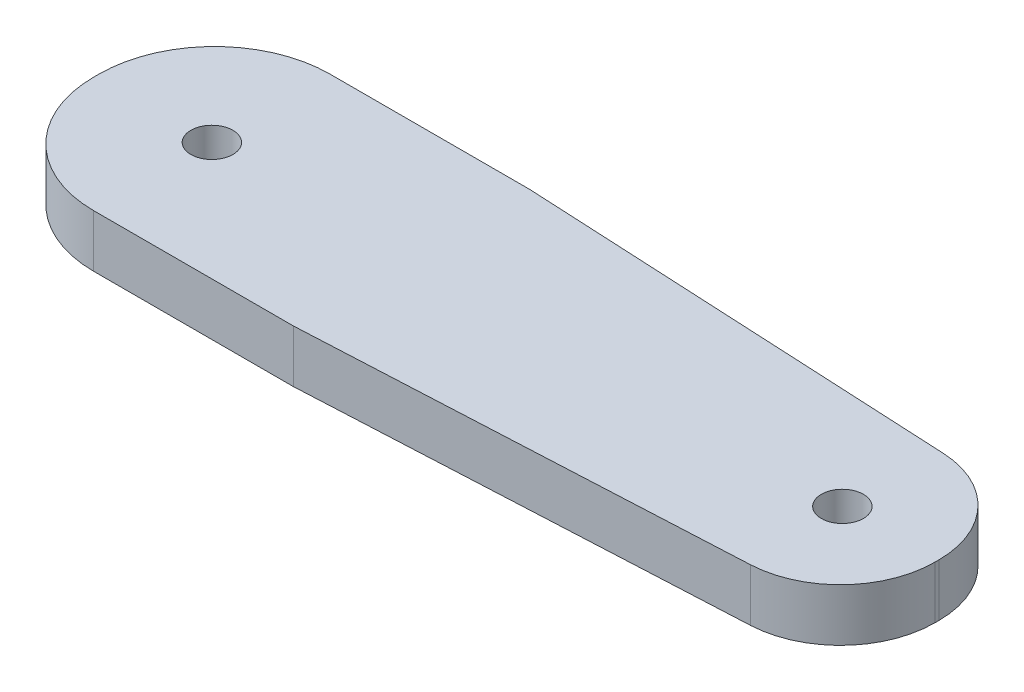
ISO-10303-21;
HEADER;
FILE_DESCRIPTION(('STEP AP214'),'2;1');
FILE_NAME('part.step','',(''),(''),'','','');
FILE_SCHEMA(('AUTOMOTIVE_DESIGN { 1 0 10303 214 1 1 1 1 }'));
ENDSEC;
DATA;
#1=APPLICATION_CONTEXT('core data for automotive mechanical design processes');
#2=APPLICATION_PROTOCOL_DEFINITION('international standard','automotive_design',2000,#1);
#3=PRODUCT_CONTEXT('',#1,'mechanical');
#4=PRODUCT('Part','Part','',(#3));
#5=PRODUCT_RELATED_PRODUCT_CATEGORY('part','',(#4));
#6=PRODUCT_DEFINITION_FORMATION('','',#4);
#7=PRODUCT_DEFINITION_CONTEXT('part definition',#1,'design');
#8=PRODUCT_DEFINITION('design','',#6,#7);
#9=PRODUCT_DEFINITION_SHAPE('','',#8);
#10=(LENGTH_UNIT() NAMED_UNIT(*) SI_UNIT(.MILLI.,.METRE.));
#11=(NAMED_UNIT(*) PLANE_ANGLE_UNIT() SI_UNIT($,.RADIAN.));
#12=(NAMED_UNIT(*) SI_UNIT($,.STERADIAN.) SOLID_ANGLE_UNIT());
#13=UNCERTAINTY_MEASURE_WITH_UNIT(LENGTH_MEASURE(1.E-05),#10,'distance_accuracy_value','');
#14=(GEOMETRIC_REPRESENTATION_CONTEXT(3) GLOBAL_UNCERTAINTY_ASSIGNED_CONTEXT((#13)) GLOBAL_UNIT_ASSIGNED_CONTEXT((#10,
#11,#12)) REPRESENTATION_CONTEXT('',''));
#15=CARTESIAN_POINT('',(0.,0.,0.));
#16=DIRECTION('',(0.,0.,1.));
#17=DIRECTION('',(1.,0.,0.));
#18=AXIS2_PLACEMENT_3D('',#15,#16,#17);
#19=CARTESIAN_POINT('',(95.,10.,-22.5));
#20=DIRECTION('',(-1.,0.,0.));
#21=DIRECTION('',(0.,0.,1.));
#22=AXIS2_PLACEMENT_3D('',#19,#20,#21);
#23=PLANE('',#22);
#24=DIRECTION('',(0.,0.,-1.));
#25=VECTOR('',#24,1.);
#26=CARTESIAN_POINT('',(95.,0.,-22.5));
#27=LINE('',#26,#25);
#28=CARTESIAN_POINT('',(95.,0.,0.377514044949283));
#29=VERTEX_POINT('',#28);
#30=CARTESIAN_POINT('',(95.,0.,-0.377514044949311));
#31=VERTEX_POINT('',#30);
#32=EDGE_CURVE('E142',#29,#31,#27,.T.);
#33=ORIENTED_EDGE('',*,*,#32,.T.);
#34=DIRECTION('',(0.,1.,0.));
#35=VECTOR('',#34,1.);
#36=CARTESIAN_POINT('',(95.,10.,-0.377514044949304));
#37=LINE('',#36,#35);
#38=CARTESIAN_POINT('',(95.,10.,-0.377514044949311));
#39=VERTEX_POINT('',#38);
#40=EDGE_CURVE('E153',#31,#39,#37,.T.);
#41=ORIENTED_EDGE('',*,*,#40,.T.);
#42=DIRECTION('',(0.,0.,-1.));
#43=VECTOR('',#42,1.);
#44=CARTESIAN_POINT('',(95.,10.,-22.5));
#45=LINE('',#44,#43);
#46=CARTESIAN_POINT('',(95.,10.,0.377514044949283));
#47=VERTEX_POINT('',#46);
#48=EDGE_CURVE('E144',#47,#39,#45,.T.);
#49=ORIENTED_EDGE('',*,*,#48,.F.);
#50=DIRECTION('',(0.,1.,0.));
#51=VECTOR('',#50,1.);
#52=CARTESIAN_POINT('',(95.,10.,0.37751404494929));
#53=LINE('',#52,#51);
#54=EDGE_CURVE('E151',#47,#29,#53,.F.);
#55=ORIENTED_EDGE('',*,*,#54,.T.);
#56=EDGE_LOOP('',(#33,#41,#49,#55));
#57=FACE_BOUND('',#56,.T.);
#58=ADVANCED_FACE('F38',(#57),#23,.F.);
#59=CARTESIAN_POINT('',(-95.,10.,-22.5));
#60=DIRECTION('',(0.,0.,1.));
#61=DIRECTION('',(1.,0.,0.));
#62=AXIS2_PLACEMENT_3D('',#59,#60,#61);
#63=PLANE('',#62);
#64=DIRECTION('',(-1.,0.,0.));
#65=VECTOR('',#64,1.);
#66=CARTESIAN_POINT('',(-95.,0.,-22.5));
#67=LINE('',#66,#65);
#68=CARTESIAN_POINT('',(-4.99999999999999,0.,-22.5));
#69=VERTEX_POINT('',#68);
#70=CARTESIAN_POINT('',(-43.,0.,-22.5));
#71=VERTEX_POINT('',#70);
#72=EDGE_CURVE('E133',#69,#71,#67,.T.);
#73=ORIENTED_EDGE('',*,*,#72,.T.);
#74=DIRECTION('',(0.,1.,0.));
#75=VECTOR('',#74,1.);
#76=CARTESIAN_POINT('',(-43.,10.,-22.5));
#77=LINE('',#76,#75);
#78=CARTESIAN_POINT('',(-43.,10.,-22.5));
#79=VERTEX_POINT('',#78);
#80=EDGE_CURVE('E169',#71,#79,#77,.T.);
#81=ORIENTED_EDGE('',*,*,#80,.T.);
#82=DIRECTION('',(-1.,0.,0.));
#83=VECTOR('',#82,1.);
#84=CARTESIAN_POINT('',(-95.,10.,-22.5));
#85=LINE('',#84,#83);
#86=CARTESIAN_POINT('',(-4.99999999999999,10.,-22.5));
#87=VERTEX_POINT('',#86);
#88=EDGE_CURVE('E136',#87,#79,#85,.T.);
#89=ORIENTED_EDGE('',*,*,#88,.F.);
#90=DIRECTION('',(0.,1.,0.));
#91=VECTOR('',#90,1.);
#92=CARTESIAN_POINT('',(-4.99999999999999,0.,-22.5));
#93=LINE('',#92,#91);
#94=EDGE_CURVE('E119',#69,#87,#93,.T.);
#95=ORIENTED_EDGE('',*,*,#94,.F.);
#96=EDGE_LOOP('',(#73,#81,#89,#95));
#97=FACE_BOUND('',#96,.T.);
#98=ADVANCED_FACE('F131',(#97),#63,.F.);
#99=CARTESIAN_POINT('',(-95.,10.,22.5));
#100=DIRECTION('',(0.,0.,-1.));
#101=DIRECTION('',(-1.,0.,0.));
#102=AXIS2_PLACEMENT_3D('',#99,#100,#101);
#103=PLANE('',#102);
#104=DIRECTION('',(1.,0.,0.));
#105=VECTOR('',#104,1.);
#106=CARTESIAN_POINT('',(-95.,10.,22.5));
#107=LINE('',#106,#105);
#108=CARTESIAN_POINT('',(-43.,10.,22.5));
#109=VERTEX_POINT('',#108);
#110=CARTESIAN_POINT('',(-4.99999999999999,10.,22.5));
#111=VERTEX_POINT('',#110);
#112=EDGE_CURVE('E154',#109,#111,#107,.T.);
#113=ORIENTED_EDGE('',*,*,#112,.F.);
#114=DIRECTION('',(0.,1.,0.));
#115=VECTOR('',#114,1.);
#116=CARTESIAN_POINT('',(-43.,10.,22.5));
#117=LINE('',#116,#115);
#118=CARTESIAN_POINT('',(-43.,0.,22.5));
#119=VERTEX_POINT('',#118);
#120=EDGE_CURVE('E11',#109,#119,#117,.F.);
#121=ORIENTED_EDGE('',*,*,#120,.T.);
#122=DIRECTION('',(1.,0.,0.));
#123=VECTOR('',#122,1.);
#124=CARTESIAN_POINT('',(-95.,0.,22.5));
#125=LINE('',#124,#123);
#126=CARTESIAN_POINT('',(-5.00000000001302,0.,22.5000000000003));
#127=VERTEX_POINT('',#126);
#128=EDGE_CURVE('E141',#119,#127,#125,.T.);
#129=ORIENTED_EDGE('',*,*,#128,.T.);
#130=DIRECTION('',(0.,1.,0.));
#131=VECTOR('',#130,1.);
#132=CARTESIAN_POINT('',(-4.99999999999999,0.,22.5));
#133=LINE('',#132,#131);
#134=EDGE_CURVE('E197',#127,#111,#133,.T.);
#135=ORIENTED_EDGE('',*,*,#134,.T.);
#136=EDGE_LOOP('',(#113,#121,#129,#135));
#137=FACE_BOUND('',#136,.T.);
#138=ADVANCED_FACE('F195',(#137),#103,.F.);
#139=CARTESIAN_POINT('',(0.,10.,0.));
#140=DIRECTION('',(0.,1.,0.));
#141=DIRECTION('',(0.,0.,1.));
#142=AXIS2_PLACEMENT_3D('',#139,#140,#141);
#143=PLANE('',#142);
#144=ORIENTED_EDGE('',*,*,#88,.T.);
#145=CARTESIAN_POINT('',(-43.,10.,-0.499999999999997));
#146=DIRECTION('',(0.,1.,0.));
#147=DIRECTION('',(0.,0.,1.));
#148=AXIS2_PLACEMENT_3D('',#145,#146,#147);
#149=CIRCLE('',#148,22.);
#150=CARTESIAN_POINT('',(-65.,10.,-0.500000000000004));
#151=VERTEX_POINT('',#150);
#152=EDGE_CURVE('E173',#79,#151,#149,.T.);
#153=ORIENTED_EDGE('',*,*,#152,.T.);
#154=DIRECTION('',(0.,0.,-1.));
#155=VECTOR('',#154,1.);
#156=CARTESIAN_POINT('',(-65.,10.,-22.5));
#157=LINE('',#156,#155);
#158=CARTESIAN_POINT('',(-65.,10.,0.499999999999997));
#159=VERTEX_POINT('',#158);
#160=EDGE_CURVE('E187',#159,#151,#157,.T.);
#161=ORIENTED_EDGE('',*,*,#160,.F.);
#162=CARTESIAN_POINT('',(-43.,10.,0.500000000000004));
#163=DIRECTION('',(0.,1.,0.));
#164=DIRECTION('',(0.,0.,1.));
#165=AXIS2_PLACEMENT_3D('',#162,#163,#164);
#166=CIRCLE('',#165,22.);
#167=EDGE_CURVE('E171',#159,#109,#166,.T.);
#168=ORIENTED_EDGE('',*,*,#167,.T.);
#169=ORIENTED_EDGE('',*,*,#112,.T.);
#170=DIRECTION('',(-0.998752338877845,0.,0.0499376169438922));
#171=VECTOR('',#170,1.);
#172=CARTESIAN_POINT('',(-4.99999999999999,10.,22.5));
#173=LINE('',#172,#171);
#174=CARTESIAN_POINT('',(77.89887710499,10.,18.3550561447505));
#175=VERTEX_POINT('',#174);
#176=EDGE_CURVE('E137',#175,#111,#173,.T.);
#177=ORIENTED_EDGE('',*,*,#176,.F.);
#178=CARTESIAN_POINT('',(77.,10.,0.377514044949297));
#179=DIRECTION('',(0.,1.,0.));
#180=DIRECTION('',(0.,0.,1.));
#181=AXIS2_PLACEMENT_3D('',#178,#179,#180);
#182=CIRCLE('',#181,18.);
#183=EDGE_CURVE('E157',#175,#47,#182,.T.);
#184=ORIENTED_EDGE('',*,*,#183,.T.);
#185=ORIENTED_EDGE('',*,*,#48,.T.);
#186=CARTESIAN_POINT('',(77.,10.,-0.377514044949297));
#187=DIRECTION('',(0.,1.,0.));
#188=DIRECTION('',(0.,0.,1.));
#189=AXIS2_PLACEMENT_3D('',#186,#187,#188);
#190=CIRCLE('',#189,18.);
#191=CARTESIAN_POINT('',(77.89887710499,10.,-18.3550561447505));
#192=VERTEX_POINT('',#191);
#193=EDGE_CURVE('E159',#39,#192,#190,.T.);
#194=ORIENTED_EDGE('',*,*,#193,.T.);
#195=DIRECTION('',(0.998752338877845,0.,0.0499376169438922));
#196=VECTOR('',#195,1.);
#197=CARTESIAN_POINT('',(-4.99999999999999,10.,-22.5));
#198=LINE('',#197,#196);
#199=EDGE_CURVE('E126',#87,#192,#198,.T.);
#200=ORIENTED_EDGE('',*,*,#199,.F.);
#201=EDGE_LOOP('',(#144,#153,#161,#168,#169,#177,#184,#185,#194,#200));
#202=FACE_BOUND('',#201,.T.);
#203=CARTESIAN_POINT('',(-43.,10.,0.));
#204=DIRECTION('',(0.,1.,0.));
#205=DIRECTION('',(0.,0.,1.));
#206=AXIS2_PLACEMENT_3D('',#203,#204,#205);
#207=CIRCLE('',#206,4.);
#208=CARTESIAN_POINT('',(-43.,10.,4.));
#209=VERTEX_POINT('',#208);
#210=EDGE_CURVE('E208',#209,#209,#207,.T.);
#211=ORIENTED_EDGE('',*,*,#210,.F.);
#212=EDGE_LOOP('',(#211));
#213=FACE_BOUND('',#212,.T.);
#214=CARTESIAN_POINT('',(77.,10.,0.));
#215=DIRECTION('',(0.,1.,0.));
#216=DIRECTION('',(0.,0.,1.));
#217=AXIS2_PLACEMENT_3D('',#214,#215,#216);
#218=CIRCLE('',#217,4.00000000000001);
#219=CARTESIAN_POINT('',(77.,10.,4.00000000000001));
#220=VERTEX_POINT('',#219);
#221=EDGE_CURVE('E202',#220,#220,#218,.T.);
#222=ORIENTED_EDGE('',*,*,#221,.F.);
#223=EDGE_LOOP('',(#222));
#224=FACE_BOUND('',#223,.T.);
#225=ADVANCED_FACE('F190',(#202,#213,#224),#143,.T.);
#226=CARTESIAN_POINT('',(0.,0.,0.));
#227=DIRECTION('',(0.,1.,0.));
#228=DIRECTION('',(0.,0.,1.));
#229=AXIS2_PLACEMENT_3D('',#226,#227,#228);
#230=PLANE('',#229);
#231=CARTESIAN_POINT('',(-43.,0.,0.));
#232=DIRECTION('',(0.,1.,0.));
#233=DIRECTION('',(0.,0.,1.));
#234=AXIS2_PLACEMENT_3D('',#231,#232,#233);
#235=CIRCLE('',#234,4.);
#236=CARTESIAN_POINT('',(-43.,0.,4.));
#237=VERTEX_POINT('',#236);
#238=EDGE_CURVE('E147',#237,#237,#235,.T.);
#239=ORIENTED_EDGE('',*,*,#238,.T.);
#240=EDGE_LOOP('',(#239));
#241=FACE_BOUND('',#240,.T.);
#242=CARTESIAN_POINT('',(77.,0.,0.));
#243=DIRECTION('',(0.,1.,0.));
#244=DIRECTION('',(0.,0.,1.));
#245=AXIS2_PLACEMENT_3D('',#242,#243,#244);
#246=CIRCLE('',#245,4.00000000000001);
#247=CARTESIAN_POINT('',(77.,0.,4.00000000000001));
#248=VERTEX_POINT('',#247);
#249=EDGE_CURVE('E205',#248,#248,#246,.T.);
#250=ORIENTED_EDGE('',*,*,#249,.T.);
#251=EDGE_LOOP('',(#250));
#252=FACE_BOUND('',#251,.T.);
#253=DIRECTION('',(0.,0.,-1.));
#254=VECTOR('',#253,1.);
#255=CARTESIAN_POINT('',(-65.,0.,-22.5));
#256=LINE('',#255,#254);
#257=CARTESIAN_POINT('',(-65.,0.,0.499999999999997));
#258=VERTEX_POINT('',#257);
#259=CARTESIAN_POINT('',(-65.,0.,-0.500000000000004));
#260=VERTEX_POINT('',#259);
#261=EDGE_CURVE('E181',#258,#260,#256,.T.);
#262=ORIENTED_EDGE('',*,*,#261,.T.);
#263=CARTESIAN_POINT('',(-43.,0.,-0.499999999999997));
#264=DIRECTION('',(0.,1.,0.));
#265=DIRECTION('',(0.,0.,1.));
#266=AXIS2_PLACEMENT_3D('',#263,#264,#265);
#267=CIRCLE('',#266,22.);
#268=EDGE_CURVE('E46',#260,#71,#267,.F.);
#269=ORIENTED_EDGE('',*,*,#268,.T.);
#270=ORIENTED_EDGE('',*,*,#72,.F.);
#271=DIRECTION('',(0.998752338877845,0.,0.0499376169438922));
#272=VECTOR('',#271,1.);
#273=CARTESIAN_POINT('',(-4.99999999999999,0.,-22.5));
#274=LINE('',#273,#272);
#275=CARTESIAN_POINT('',(77.89887710499,0.,-18.3550561447505));
#276=VERTEX_POINT('',#275);
#277=EDGE_CURVE('E115',#69,#276,#274,.T.);
#278=ORIENTED_EDGE('',*,*,#277,.T.);
#279=CARTESIAN_POINT('',(77.,0.,-0.377514044949297));
#280=DIRECTION('',(0.,1.,0.));
#281=DIRECTION('',(0.,0.,1.));
#282=AXIS2_PLACEMENT_3D('',#279,#280,#281);
#283=CIRCLE('',#282,18.);
#284=EDGE_CURVE('E164',#276,#31,#283,.F.);
#285=ORIENTED_EDGE('',*,*,#284,.T.);
#286=ORIENTED_EDGE('',*,*,#32,.F.);
#287=CARTESIAN_POINT('',(77.,0.,0.377514044949297));
#288=DIRECTION('',(0.,1.,0.));
#289=DIRECTION('',(0.,0.,1.));
#290=AXIS2_PLACEMENT_3D('',#287,#288,#289);
#291=CIRCLE('',#290,18.);
#292=CARTESIAN_POINT('',(77.89887710499,0.,18.3550561447505));
#293=VERTEX_POINT('',#292);
#294=EDGE_CURVE('E162',#29,#293,#291,.F.);
#295=ORIENTED_EDGE('',*,*,#294,.T.);
#296=DIRECTION('',(-0.998752338877845,0.,0.0499376169438922));
#297=VECTOR('',#296,1.);
#298=CARTESIAN_POINT('',(-4.99999999999999,0.,22.5));
#299=LINE('',#298,#297);
#300=EDGE_CURVE('E214',#293,#127,#299,.T.);
#301=ORIENTED_EDGE('',*,*,#300,.T.);
#302=ORIENTED_EDGE('',*,*,#128,.F.);
#303=CARTESIAN_POINT('',(-43.,0.,0.500000000000004));
#304=DIRECTION('',(0.,1.,0.));
#305=DIRECTION('',(0.,0.,1.));
#306=AXIS2_PLACEMENT_3D('',#303,#304,#305);
#307=CIRCLE('',#306,22.);
#308=EDGE_CURVE('E179',#119,#258,#307,.F.);
#309=ORIENTED_EDGE('',*,*,#308,.T.);
#310=EDGE_LOOP('',(#262,#269,#270,#278,#285,#286,#295,#301,#302,#309));
#311=FACE_BOUND('',#310,.T.);
#312=ADVANCED_FACE('F139',(#241,#252,#311),#230,.F.);
#313=CARTESIAN_POINT('',(77.,0.,0.));
#314=DIRECTION('',(0.,1.,0.));
#315=DIRECTION('',(0.,0.,1.));
#316=AXIS2_PLACEMENT_3D('',#313,#314,#315);
#317=CYLINDRICAL_SURFACE('',#316,4.00000000000001);
#318=ORIENTED_EDGE('',*,*,#249,.F.);
#319=EDGE_LOOP('',(#318));
#320=FACE_BOUND('',#319,.T.);
#321=ORIENTED_EDGE('',*,*,#221,.T.);
#322=EDGE_LOOP('',(#321));
#323=FACE_BOUND('',#322,.T.);
#324=ADVANCED_FACE('F240',(#320,#323),#317,.F.);
#325=CARTESIAN_POINT('',(-43.,0.,0.));
#326=DIRECTION('',(0.,1.,0.));
#327=DIRECTION('',(0.,0.,1.));
#328=AXIS2_PLACEMENT_3D('',#325,#326,#327);
#329=CYLINDRICAL_SURFACE('',#328,4.);
#330=ORIENTED_EDGE('',*,*,#238,.F.);
#331=EDGE_LOOP('',(#330));
#332=FACE_BOUND('',#331,.T.);
#333=ORIENTED_EDGE('',*,*,#210,.T.);
#334=EDGE_LOOP('',(#333));
#335=FACE_BOUND('',#334,.T.);
#336=ADVANCED_FACE('F233',(#332,#335),#329,.F.);
#337=CARTESIAN_POINT('',(-4.99999999999999,0.,22.5));
#338=DIRECTION('',(-0.0499376169438922,0.,-0.998752338877845));
#339=DIRECTION('',(-0.998752338877845,0.,0.0499376169438923));
#340=AXIS2_PLACEMENT_3D('',#337,#338,#339);
#341=PLANE('',#340);
#342=ORIENTED_EDGE('',*,*,#300,.F.);
#343=DIRECTION('',(0.,1.,0.));
#344=VECTOR('',#343,1.);
#345=CARTESIAN_POINT('',(77.8988771049901,0.,18.3550561447505));
#346=LINE('',#345,#344);
#347=EDGE_CURVE('E166',#293,#175,#346,.T.);
#348=ORIENTED_EDGE('',*,*,#347,.T.);
#349=ORIENTED_EDGE('',*,*,#176,.T.);
#350=ORIENTED_EDGE('',*,*,#134,.F.);
#351=EDGE_LOOP('',(#342,#348,#349,#350));
#352=FACE_BOUND('',#351,.T.);
#353=ADVANCED_FACE('F231',(#352),#341,.F.);
#354=CARTESIAN_POINT('',(-4.99999999999999,0.,-22.5));
#355=DIRECTION('',(-0.0499376169438922,0.,0.998752338877845));
#356=DIRECTION('',(0.998752338877845,0.,0.0499376169438923));
#357=AXIS2_PLACEMENT_3D('',#354,#355,#356);
#358=PLANE('',#357);
#359=ORIENTED_EDGE('',*,*,#199,.T.);
#360=DIRECTION('',(0.,1.,0.));
#361=VECTOR('',#360,1.);
#362=CARTESIAN_POINT('',(77.8988771049901,0.,-18.3550561447505));
#363=LINE('',#362,#361);
#364=EDGE_CURVE('E122',#192,#276,#363,.F.);
#365=ORIENTED_EDGE('',*,*,#364,.T.);
#366=ORIENTED_EDGE('',*,*,#277,.F.);
#367=ORIENTED_EDGE('',*,*,#94,.T.);
#368=EDGE_LOOP('',(#359,#365,#366,#367));
#369=FACE_BOUND('',#368,.T.);
#370=ADVANCED_FACE('F118',(#369),#358,.F.);
#371=CARTESIAN_POINT('',(-65.,0.,-22.5));
#372=DIRECTION('',(1.,0.,0.));
#373=DIRECTION('',(0.,0.,-1.));
#374=AXIS2_PLACEMENT_3D('',#371,#372,#373);
#375=PLANE('',#374);
#376=ORIENTED_EDGE('',*,*,#160,.T.);
#377=DIRECTION('',(0.,1.,0.));
#378=VECTOR('',#377,1.);
#379=CARTESIAN_POINT('',(-65.,0.,-0.499999999999997));
#380=LINE('',#379,#378);
#381=EDGE_CURVE('E59',#151,#260,#380,.F.);
#382=ORIENTED_EDGE('',*,*,#381,.T.);
#383=ORIENTED_EDGE('',*,*,#261,.F.);
#384=DIRECTION('',(0.,1.,0.));
#385=VECTOR('',#384,1.);
#386=CARTESIAN_POINT('',(-65.,0.,0.500000000000004));
#387=LINE('',#386,#385);
#388=EDGE_CURVE('E175',#258,#159,#387,.T.);
#389=ORIENTED_EDGE('',*,*,#388,.T.);
#390=EDGE_LOOP('',(#376,#382,#383,#389));
#391=FACE_BOUND('',#390,.T.);
#392=ADVANCED_FACE('F185',(#391),#375,.F.);
#393=CARTESIAN_POINT('',(77.,10.,-0.377514044949297));
#394=DIRECTION('',(0.,1.,0.));
#395=DIRECTION('',(0.,0.,1.));
#396=AXIS2_PLACEMENT_3D('',#393,#394,#395);
#397=CYLINDRICAL_SURFACE('',#396,18.);
#398=ORIENTED_EDGE('',*,*,#284,.F.);
#399=ORIENTED_EDGE('',*,*,#364,.F.);
#400=ORIENTED_EDGE('',*,*,#193,.F.);
#401=ORIENTED_EDGE('',*,*,#40,.F.);
#402=EDGE_LOOP('',(#398,#399,#400,#401));
#403=FACE_BOUND('',#402,.T.);
#404=ADVANCED_FACE('F219',(#403),#397,.T.);
#405=CARTESIAN_POINT('',(77.,0.,0.377514044949297));
#406=DIRECTION('',(0.,1.,0.));
#407=DIRECTION('',(0.,0.,1.));
#408=AXIS2_PLACEMENT_3D('',#405,#406,#407);
#409=CYLINDRICAL_SURFACE('',#408,18.);
#410=ORIENTED_EDGE('',*,*,#294,.F.);
#411=ORIENTED_EDGE('',*,*,#54,.F.);
#412=ORIENTED_EDGE('',*,*,#183,.F.);
#413=ORIENTED_EDGE('',*,*,#347,.F.);
#414=EDGE_LOOP('',(#410,#411,#412,#413));
#415=FACE_BOUND('',#414,.T.);
#416=ADVANCED_FACE('F227',(#415),#409,.T.);
#417=CARTESIAN_POINT('',(-43.,10.,-0.499999999999997));
#418=DIRECTION('',(0.,1.,0.));
#419=DIRECTION('',(0.,0.,1.));
#420=AXIS2_PLACEMENT_3D('',#417,#418,#419);
#421=CYLINDRICAL_SURFACE('',#420,22.);
#422=ORIENTED_EDGE('',*,*,#268,.F.);
#423=ORIENTED_EDGE('',*,*,#381,.F.);
#424=ORIENTED_EDGE('',*,*,#152,.F.);
#425=ORIENTED_EDGE('',*,*,#80,.F.);
#426=EDGE_LOOP('',(#422,#423,#424,#425));
#427=FACE_BOUND('',#426,.T.);
#428=ADVANCED_FACE('F255',(#427),#421,.T.);
#429=CARTESIAN_POINT('',(-43.,0.,0.500000000000004));
#430=DIRECTION('',(0.,1.,0.));
#431=DIRECTION('',(0.,0.,1.));
#432=AXIS2_PLACEMENT_3D('',#429,#430,#431);
#433=CYLINDRICAL_SURFACE('',#432,22.);
#434=ORIENTED_EDGE('',*,*,#308,.F.);
#435=ORIENTED_EDGE('',*,*,#120,.F.);
#436=ORIENTED_EDGE('',*,*,#167,.F.);
#437=ORIENTED_EDGE('',*,*,#388,.F.);
#438=EDGE_LOOP('',(#434,#435,#436,#437));
#439=FACE_BOUND('',#438,.T.);
#440=ADVANCED_FACE('F40',(#439),#433,.T.);
#441=CLOSED_SHELL('',(#58,#98,#138,#225,#312,#324,#336,#353,#370,#392,#404,#416,#428,#440));
#442=MANIFOLD_SOLID_BREP('B2',#441);
#443=ADVANCED_BREP_SHAPE_REPRESENTATION('',(#18,#442),#14);
#444=SHAPE_DEFINITION_REPRESENTATION(#9,#443);
ENDSEC;
END-ISO-10303-21;
